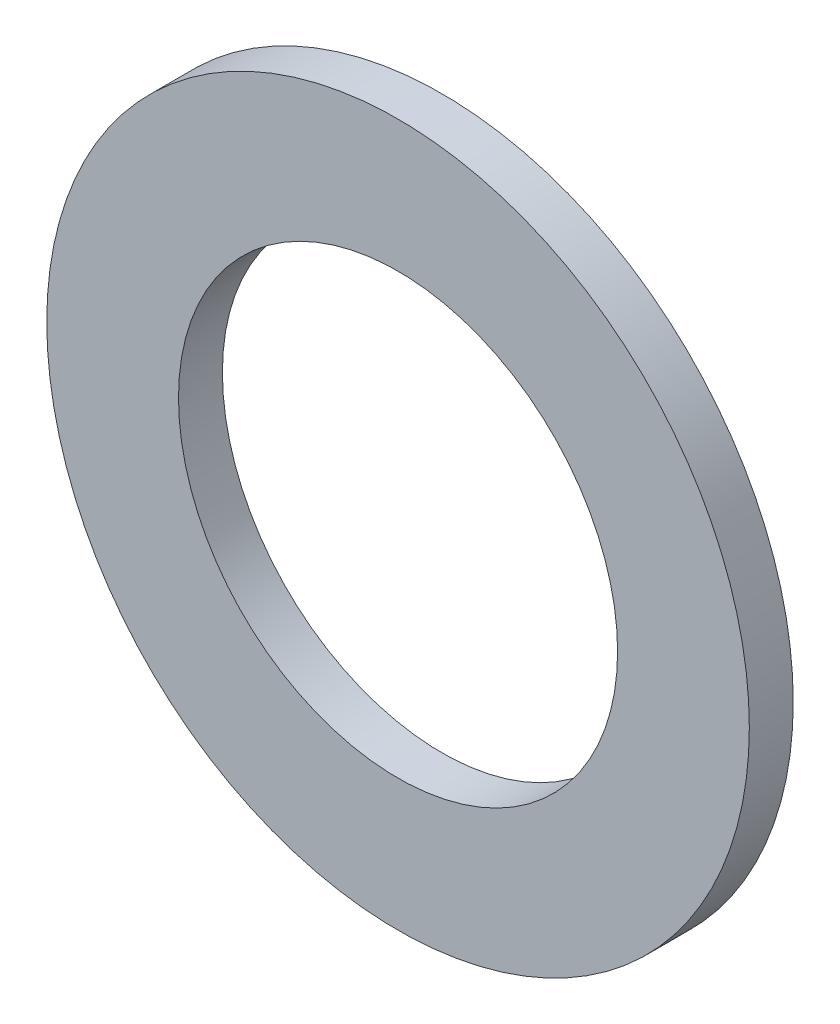
ISO-10303-21;
HEADER;
FILE_DESCRIPTION(('STEP AP214'),'2;1');
FILE_NAME('part.step','',(''),(''),'','','');
FILE_SCHEMA(('AUTOMOTIVE_DESIGN { 1 0 10303 214 1 1 1 1 }'));
ENDSEC;
DATA;
#1=APPLICATION_CONTEXT('core data for automotive mechanical design processes');
#2=APPLICATION_PROTOCOL_DEFINITION('international standard','automotive_design',2000,#1);
#3=PRODUCT_CONTEXT('',#1,'mechanical');
#4=PRODUCT('Part','Part','',(#3));
#5=PRODUCT_RELATED_PRODUCT_CATEGORY('part','',(#4));
#6=PRODUCT_DEFINITION_FORMATION('','',#4);
#7=PRODUCT_DEFINITION_CONTEXT('part definition',#1,'design');
#8=PRODUCT_DEFINITION('design','',#6,#7);
#9=PRODUCT_DEFINITION_SHAPE('','',#8);
#10=(LENGTH_UNIT() NAMED_UNIT(*) SI_UNIT(.MILLI.,.METRE.));
#11=(NAMED_UNIT(*) PLANE_ANGLE_UNIT() SI_UNIT($,.RADIAN.));
#12=(NAMED_UNIT(*) SI_UNIT($,.STERADIAN.) SOLID_ANGLE_UNIT());
#13=UNCERTAINTY_MEASURE_WITH_UNIT(LENGTH_MEASURE(1.E-05),#10,'distance_accuracy_value','');
#14=(GEOMETRIC_REPRESENTATION_CONTEXT(3) GLOBAL_UNCERTAINTY_ASSIGNED_CONTEXT((#13)) GLOBAL_UNIT_ASSIGNED_CONTEXT((#10,
#11,#12)) REPRESENTATION_CONTEXT('',''));
#15=CARTESIAN_POINT('',(0.,0.,0.));
#16=DIRECTION('',(0.,0.,1.));
#17=DIRECTION('',(1.,0.,0.));
#18=AXIS2_PLACEMENT_3D('',#15,#16,#17);
#19=CARTESIAN_POINT('',(0.,0.,1.));
#20=DIRECTION('',(0.,0.,1.));
#21=DIRECTION('',(1.,0.,0.));
#22=AXIS2_PLACEMENT_3D('',#19,#20,#21);
#23=PLANE('',#22);
#24=CARTESIAN_POINT('',(0.,0.,1.));
#25=DIRECTION('',(0.,0.,1.));
#26=DIRECTION('',(1.,0.,0.));
#27=AXIS2_PLACEMENT_3D('',#24,#25,#26);
#28=CIRCLE('',#27,8.);
#29=CARTESIAN_POINT('',(8.,0.,1.));
#30=VERTEX_POINT('',#29);
#31=EDGE_CURVE('E10',#30,#30,#28,.T.);
#32=ORIENTED_EDGE('',*,*,#31,.T.);
#33=EDGE_LOOP('',(#32));
#34=FACE_BOUND('',#33,.T.);
#35=CARTESIAN_POINT('',(0.,0.,1.));
#36=DIRECTION('',(0.,0.,1.));
#37=DIRECTION('',(1.,0.,0.));
#38=AXIS2_PLACEMENT_3D('',#35,#36,#37);
#39=CIRCLE('',#38,5.);
#40=CARTESIAN_POINT('',(5.,0.,1.));
#41=VERTEX_POINT('',#40);
#42=EDGE_CURVE('E46',#41,#41,#39,.T.);
#43=ORIENTED_EDGE('',*,*,#42,.F.);
#44=EDGE_LOOP('',(#43));
#45=FACE_BOUND('',#44,.T.);
#46=ADVANCED_FACE('F35',(#34,#45),#23,.T.);
#47=CARTESIAN_POINT('',(0.,0.,0.));
#48=DIRECTION('',(0.,0.,1.));
#49=DIRECTION('',(1.,0.,0.));
#50=AXIS2_PLACEMENT_3D('',#47,#48,#49);
#51=PLANE('',#50);
#52=CARTESIAN_POINT('',(0.,0.,0.));
#53=DIRECTION('',(0.,0.,1.));
#54=DIRECTION('',(1.,0.,0.));
#55=AXIS2_PLACEMENT_3D('',#52,#53,#54);
#56=CIRCLE('',#55,8.);
#57=CARTESIAN_POINT('',(8.,0.,0.));
#58=VERTEX_POINT('',#57);
#59=EDGE_CURVE('E39',#58,#58,#56,.T.);
#60=ORIENTED_EDGE('',*,*,#59,.F.);
#61=EDGE_LOOP('',(#60));
#62=FACE_BOUND('',#61,.T.);
#63=CARTESIAN_POINT('',(0.,0.,0.));
#64=DIRECTION('',(0.,0.,1.));
#65=DIRECTION('',(1.,0.,0.));
#66=AXIS2_PLACEMENT_3D('',#63,#64,#65);
#67=CIRCLE('',#66,5.);
#68=CARTESIAN_POINT('',(5.,0.,0.));
#69=VERTEX_POINT('',#68);
#70=EDGE_CURVE('E48',#69,#69,#67,.T.);
#71=ORIENTED_EDGE('',*,*,#70,.T.);
#72=EDGE_LOOP('',(#71));
#73=FACE_BOUND('',#72,.T.);
#74=ADVANCED_FACE('F58',(#62,#73),#51,.F.);
#75=CARTESIAN_POINT('',(0.,0.,1.));
#76=DIRECTION('',(0.,0.,-1.));
#77=DIRECTION('',(-1.,0.,0.));
#78=AXIS2_PLACEMENT_3D('',#75,#76,#77);
#79=CYLINDRICAL_SURFACE('',#78,8.);
#80=ORIENTED_EDGE('',*,*,#31,.F.);
#81=EDGE_LOOP('',(#80));
#82=FACE_BOUND('',#81,.T.);
#83=ORIENTED_EDGE('',*,*,#59,.T.);
#84=EDGE_LOOP('',(#83));
#85=FACE_BOUND('',#84,.T.);
#86=ADVANCED_FACE('F37',(#82,#85),#79,.T.);
#87=CARTESIAN_POINT('',(0.,0.,1.));
#88=DIRECTION('',(0.,0.,-1.));
#89=DIRECTION('',(-1.,0.,0.));
#90=AXIS2_PLACEMENT_3D('',#87,#88,#89);
#91=CYLINDRICAL_SURFACE('',#90,5.);
#92=ORIENTED_EDGE('',*,*,#42,.T.);
#93=EDGE_LOOP('',(#92));
#94=FACE_BOUND('',#93,.T.);
#95=ORIENTED_EDGE('',*,*,#70,.F.);
#96=EDGE_LOOP('',(#95));
#97=FACE_BOUND('',#96,.T.);
#98=ADVANCED_FACE('F54',(#94,#97),#91,.F.);
#99=CLOSED_SHELL('',(#46,#74,#86,#98));
#100=MANIFOLD_SOLID_BREP('B2',#99);
#101=ADVANCED_BREP_SHAPE_REPRESENTATION('',(#18,#100),#14);
#102=SHAPE_DEFINITION_REPRESENTATION(#9,#101);
ENDSEC;
END-ISO-10303-21;
